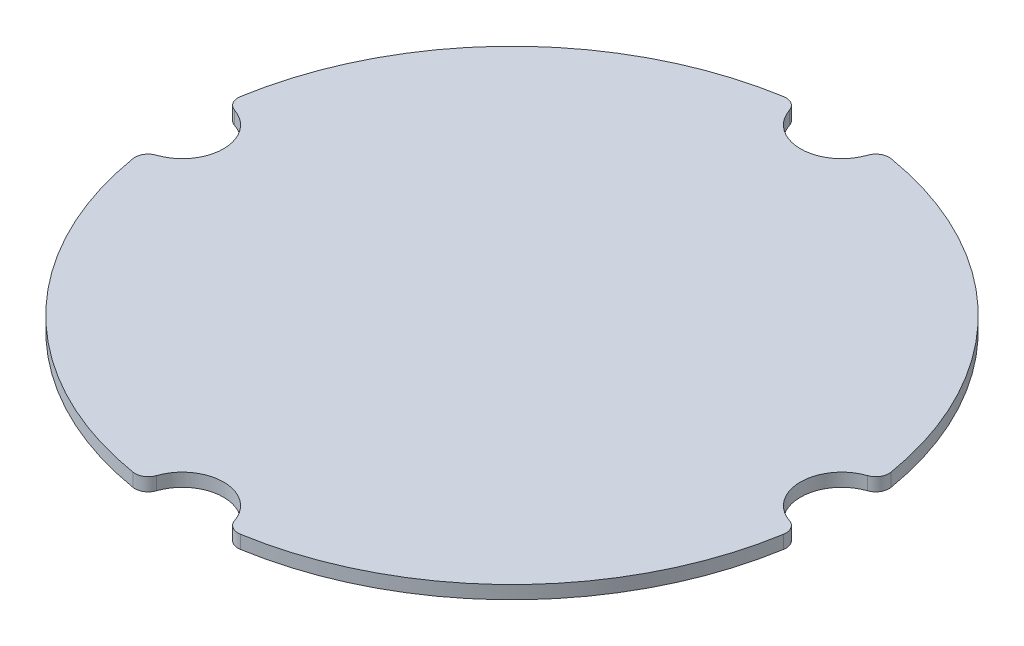
ISO-10303-21;
HEADER;
FILE_DESCRIPTION(('STEP AP214'),'2;1');
FILE_NAME('part.step','',(''),(''),'','','');
FILE_SCHEMA(('AUTOMOTIVE_DESIGN { 1 0 10303 214 1 1 1 1 }'));
ENDSEC;
DATA;
#1=APPLICATION_CONTEXT('core data for automotive mechanical design processes');
#2=APPLICATION_PROTOCOL_DEFINITION('international standard','automotive_design',2000,#1);
#3=PRODUCT_CONTEXT('',#1,'mechanical');
#4=PRODUCT('Part','Part','',(#3));
#5=PRODUCT_RELATED_PRODUCT_CATEGORY('part','',(#4));
#6=PRODUCT_DEFINITION_FORMATION('','',#4);
#7=PRODUCT_DEFINITION_CONTEXT('part definition',#1,'design');
#8=PRODUCT_DEFINITION('design','',#6,#7);
#9=PRODUCT_DEFINITION_SHAPE('','',#8);
#10=(LENGTH_UNIT() NAMED_UNIT(*) SI_UNIT(.MILLI.,.METRE.));
#11=(NAMED_UNIT(*) PLANE_ANGLE_UNIT() SI_UNIT($,.RADIAN.));
#12=(NAMED_UNIT(*) SI_UNIT($,.STERADIAN.) SOLID_ANGLE_UNIT());
#13=UNCERTAINTY_MEASURE_WITH_UNIT(LENGTH_MEASURE(1.E-05),#10,'distance_accuracy_value','');
#14=(GEOMETRIC_REPRESENTATION_CONTEXT(3) GLOBAL_UNCERTAINTY_ASSIGNED_CONTEXT((#13)) GLOBAL_UNIT_ASSIGNED_CONTEXT((#10,
#11,#12)) REPRESENTATION_CONTEXT('',''));
#15=CARTESIAN_POINT('',(0.,0.,0.));
#16=DIRECTION('',(0.,0.,1.));
#17=DIRECTION('',(1.,0.,0.));
#18=AXIS2_PLACEMENT_3D('',#15,#16,#17);
#19=CARTESIAN_POINT('',(0.,2.54,0.));
#20=DIRECTION('',(0.,-1.,0.));
#21=DIRECTION('',(0.,0.,-1.));
#22=AXIS2_PLACEMENT_3D('',#19,#20,#21);
#23=CYLINDRICAL_SURFACE('',#22,63.5);
#24=CARTESIAN_POINT('',(0.,2.54,0.));
#25=DIRECTION('',(0.,1.,0.));
#26=DIRECTION('',(0.,0.,1.));
#27=AXIS2_PLACEMENT_3D('',#24,#25,#26);
#28=CIRCLE('',#27,63.5);
#29=CARTESIAN_POINT('',(10.339894968625,2.54,62.6525065104167));
#30=VERTEX_POINT('',#29);
#31=CARTESIAN_POINT('',(62.6525065104166,2.54,10.3398949686253));
#32=VERTEX_POINT('',#31);
#33=EDGE_CURVE('E317',#30,#32,#28,.T.);
#34=ORIENTED_EDGE('',*,*,#33,.F.);
#35=DIRECTION('',(0.,-1.,0.));
#36=VECTOR('',#35,1.);
#37=CARTESIAN_POINT('',(10.339894968625,2.54,62.6525065104167));
#38=LINE('',#37,#36);
#39=CARTESIAN_POINT('',(10.339894968625,0.,62.6525065104167));
#40=VERTEX_POINT('',#39);
#41=EDGE_CURVE('E262',#30,#40,#38,.T.);
#42=ORIENTED_EDGE('',*,*,#41,.T.);
#43=CARTESIAN_POINT('',(0.,0.,0.));
#44=DIRECTION('',(0.,1.,0.));
#45=DIRECTION('',(0.,0.,1.));
#46=AXIS2_PLACEMENT_3D('',#43,#44,#45);
#47=CIRCLE('',#46,63.5);
#48=CARTESIAN_POINT('',(62.6525065104166,0.,10.3398949686253));
#49=VERTEX_POINT('',#48);
#50=EDGE_CURVE('E193',#40,#49,#47,.T.);
#51=ORIENTED_EDGE('',*,*,#50,.T.);
#52=DIRECTION('',(0.,-1.,0.));
#53=VECTOR('',#52,1.);
#54=CARTESIAN_POINT('',(62.6525065104166,2.54,10.3398949686253));
#55=LINE('',#54,#53);
#56=EDGE_CURVE('E327',#49,#32,#55,.F.);
#57=ORIENTED_EDGE('',*,*,#56,.T.);
#58=EDGE_LOOP('',(#34,#42,#51,#57));
#59=FACE_BOUND('',#58,.T.);
#60=ADVANCED_FACE('F42',(#59),#23,.T.);
#61=CARTESIAN_POINT('',(-62.6525065104168,2.54,10.3398949686244));
#62=VERTEX_POINT('',#61);
#63=CARTESIAN_POINT('',(-10.339894968625,2.54,62.6525065104167));
#64=VERTEX_POINT('',#63);
#65=EDGE_CURVE('E204',#62,#64,#28,.T.);
#66=ORIENTED_EDGE('',*,*,#65,.F.);
#67=DIRECTION('',(0.,-1.,0.));
#68=VECTOR('',#67,1.);
#69=CARTESIAN_POINT('',(-62.6525065104168,2.54,10.3398949686244));
#70=LINE('',#69,#68);
#71=CARTESIAN_POINT('',(-62.6525065104168,0.,10.3398949686244));
#72=VERTEX_POINT('',#71);
#73=EDGE_CURVE('E12',#62,#72,#70,.T.);
#74=ORIENTED_EDGE('',*,*,#73,.T.);
#75=CARTESIAN_POINT('',(-10.339894968625,0.,62.6525065104167));
#76=VERTEX_POINT('',#75);
#77=EDGE_CURVE('E314',#72,#76,#47,.T.);
#78=ORIENTED_EDGE('',*,*,#77,.T.);
#79=DIRECTION('',(0.,-1.,0.));
#80=VECTOR('',#79,1.);
#81=CARTESIAN_POINT('',(-10.339894968625,2.54,62.6525065104167));
#82=LINE('',#81,#80);
#83=EDGE_CURVE('E251',#76,#64,#82,.F.);
#84=ORIENTED_EDGE('',*,*,#83,.T.);
#85=EDGE_LOOP('',(#66,#74,#78,#84));
#86=FACE_BOUND('',#85,.T.);
#87=ADVANCED_FACE('F387',(#86),#23,.T.);
#88=CARTESIAN_POINT('',(-10.339894968625,0.,-62.6525065104167));
#89=VERTEX_POINT('',#88);
#90=CARTESIAN_POINT('',(-62.6525065104166,0.,-10.3398949686257));
#91=VERTEX_POINT('',#90);
#92=EDGE_CURVE('E195',#89,#91,#47,.T.);
#93=ORIENTED_EDGE('',*,*,#92,.T.);
#94=DIRECTION('',(0.,-1.,0.));
#95=VECTOR('',#94,1.);
#96=CARTESIAN_POINT('',(-62.6525065104166,2.54,-10.3398949686257));
#97=LINE('',#96,#95);
#98=CARTESIAN_POINT('',(-62.6525065104166,2.54,-10.3398949686257));
#99=VERTEX_POINT('',#98);
#100=EDGE_CURVE('E66',#91,#99,#97,.F.);
#101=ORIENTED_EDGE('',*,*,#100,.T.);
#102=CARTESIAN_POINT('',(-10.339894968625,2.54,-62.6525065104167));
#103=VERTEX_POINT('',#102);
#104=EDGE_CURVE('E201',#103,#99,#28,.T.);
#105=ORIENTED_EDGE('',*,*,#104,.F.);
#106=DIRECTION('',(0.,-1.,0.));
#107=VECTOR('',#106,1.);
#108=CARTESIAN_POINT('',(-10.339894968625,2.54,-62.6525065104167));
#109=LINE('',#108,#107);
#110=EDGE_CURVE('E169',#103,#89,#109,.T.);
#111=ORIENTED_EDGE('',*,*,#110,.T.);
#112=EDGE_LOOP('',(#93,#101,#105,#111));
#113=FACE_BOUND('',#112,.T.);
#114=ADVANCED_FACE('F311',(#113),#23,.T.);
#115=CARTESIAN_POINT('',(62.6525065104167,2.54,-10.3398949686248));
#116=VERTEX_POINT('',#115);
#117=CARTESIAN_POINT('',(10.339894968625,2.54,-62.6525065104167));
#118=VERTEX_POINT('',#117);
#119=EDGE_CURVE('E205',#116,#118,#28,.T.);
#120=ORIENTED_EDGE('',*,*,#119,.F.);
#121=DIRECTION('',(0.,-1.,0.));
#122=VECTOR('',#121,1.);
#123=CARTESIAN_POINT('',(62.6525065104167,2.54,-10.3398949686248));
#124=LINE('',#123,#122);
#125=CARTESIAN_POINT('',(62.6525065104167,0.,-10.3398949686248));
#126=VERTEX_POINT('',#125);
#127=EDGE_CURVE('E230',#116,#126,#124,.T.);
#128=ORIENTED_EDGE('',*,*,#127,.T.);
#129=CARTESIAN_POINT('',(10.339894968625,0.,-62.6525065104167));
#130=VERTEX_POINT('',#129);
#131=EDGE_CURVE('E189',#126,#130,#47,.T.);
#132=ORIENTED_EDGE('',*,*,#131,.T.);
#133=DIRECTION('',(0.,-1.,0.));
#134=VECTOR('',#133,1.);
#135=CARTESIAN_POINT('',(10.339894968625,2.54,-62.6525065104167));
#136=LINE('',#135,#134);
#137=EDGE_CURVE('E164',#130,#118,#136,.F.);
#138=ORIENTED_EDGE('',*,*,#137,.T.);
#139=EDGE_LOOP('',(#120,#128,#132,#138));
#140=FACE_BOUND('',#139,.T.);
#141=ADVANCED_FACE('F372',(#140),#23,.T.);
#142=CARTESIAN_POINT('',(0.,2.54,0.));
#143=DIRECTION('',(0.,1.,0.));
#144=DIRECTION('',(0.,0.,1.));
#145=AXIS2_PLACEMENT_3D('',#142,#143,#144);
#146=PLANE('',#145);
#147=ORIENTED_EDGE('',*,*,#104,.T.);
#148=CARTESIAN_POINT('',(-60.1464062499999,2.54,-9.92629916988066));
#149=DIRECTION('',(0.,1.,0.));
#150=DIRECTION('',(0.,0.,1.));
#151=AXIS2_PLACEMENT_3D('',#148,#149,#150);
#152=CIRCLE('',#151,2.54);
#153=CARTESIAN_POINT('',(-60.9593986742423,2.54,-7.51992361354612));
#154=VERTEX_POINT('',#153);
#155=EDGE_CURVE('E51',#99,#154,#152,.T.);
#156=ORIENTED_EDGE('',*,*,#155,.T.);
#157=CARTESIAN_POINT('',(-63.5,2.54,-6.65127195049617E-13));
#158=DIRECTION('',(0.,1.,0.));
#159=DIRECTION('',(1.,0.,0.));
#160=AXIS2_PLACEMENT_3D('',#157,#158,#159);
#161=CIRCLE('',#160,7.93750000000001);
#162=CARTESIAN_POINT('',(-60.9593986742425,2.54,7.51992361354484));
#163=VERTEX_POINT('',#162);
#164=EDGE_CURVE('E277',#163,#154,#161,.T.);
#165=ORIENTED_EDGE('',*,*,#164,.F.);
#166=CARTESIAN_POINT('',(-60.1464062500001,2.54,9.9262991698794));
#167=DIRECTION('',(0.,1.,0.));
#168=DIRECTION('',(0.,0.,1.));
#169=AXIS2_PLACEMENT_3D('',#166,#167,#168);
#170=CIRCLE('',#169,2.54);
#171=EDGE_CURVE('E58',#163,#62,#170,.T.);
#172=ORIENTED_EDGE('',*,*,#171,.T.);
#173=ORIENTED_EDGE('',*,*,#65,.T.);
#174=CARTESIAN_POINT('',(-9.92629916988003,2.54,60.14640625));
#175=DIRECTION('',(0.,1.,0.));
#176=DIRECTION('',(0.,0.,1.));
#177=AXIS2_PLACEMENT_3D('',#174,#175,#176);
#178=CIRCLE('',#177,2.54);
#179=CARTESIAN_POINT('',(-7.51992361354548,2.54,60.9593986742424));
#180=VERTEX_POINT('',#179);
#181=EDGE_CURVE('E258',#64,#180,#178,.T.);
#182=ORIENTED_EDGE('',*,*,#181,.T.);
#183=CARTESIAN_POINT('',(0.,2.54,63.5));
#184=DIRECTION('',(0.,1.,0.));
#185=DIRECTION('',(0.,0.,-1.));
#186=AXIS2_PLACEMENT_3D('',#183,#184,#185);
#187=CIRCLE('',#186,7.93750000000001);
#188=CARTESIAN_POINT('',(7.51992361354548,2.54,60.9593986742424));
#189=VERTEX_POINT('',#188);
#190=EDGE_CURVE('E265',#189,#180,#187,.T.);
#191=ORIENTED_EDGE('',*,*,#190,.F.);
#192=CARTESIAN_POINT('',(9.92629916988003,2.54,60.14640625));
#193=DIRECTION('',(0.,1.,0.));
#194=DIRECTION('',(0.,0.,1.));
#195=AXIS2_PLACEMENT_3D('',#192,#193,#194);
#196=CIRCLE('',#195,2.54);
#197=EDGE_CURVE('E254',#189,#30,#196,.T.);
#198=ORIENTED_EDGE('',*,*,#197,.T.);
#199=ORIENTED_EDGE('',*,*,#33,.T.);
#200=CARTESIAN_POINT('',(60.14640625,2.54,9.92629916988024));
#201=DIRECTION('',(0.,1.,0.));
#202=DIRECTION('',(0.,0.,1.));
#203=AXIS2_PLACEMENT_3D('',#200,#201,#202);
#204=CIRCLE('',#203,2.54);
#205=CARTESIAN_POINT('',(60.9593986742424,2.54,7.51992361354569));
#206=VERTEX_POINT('',#205);
#207=EDGE_CURVE('E225',#32,#206,#204,.T.);
#208=ORIENTED_EDGE('',*,*,#207,.T.);
#209=CARTESIAN_POINT('',(63.5,2.54,2.21709065016539E-13));
#210=DIRECTION('',(0.,1.,0.));
#211=DIRECTION('',(-1.,0.,0.));
#212=AXIS2_PLACEMENT_3D('',#209,#210,#211);
#213=CIRCLE('',#212,7.93750000000001);
#214=CARTESIAN_POINT('',(60.9593986742424,2.54,-7.51992361354527));
#215=VERTEX_POINT('',#214);
#216=EDGE_CURVE('E276',#215,#206,#213,.T.);
#217=ORIENTED_EDGE('',*,*,#216,.F.);
#218=CARTESIAN_POINT('',(60.14640625,2.54,-9.92629916987982));
#219=DIRECTION('',(0.,1.,0.));
#220=DIRECTION('',(0.,0.,1.));
#221=AXIS2_PLACEMENT_3D('',#218,#219,#220);
#222=CIRCLE('',#221,2.54);
#223=EDGE_CURVE('E231',#215,#116,#222,.T.);
#224=ORIENTED_EDGE('',*,*,#223,.T.);
#225=ORIENTED_EDGE('',*,*,#119,.T.);
#226=CARTESIAN_POINT('',(9.92629916988003,2.54,-60.14640625));
#227=DIRECTION('',(0.,1.,0.));
#228=DIRECTION('',(0.,0.,1.));
#229=AXIS2_PLACEMENT_3D('',#226,#227,#228);
#230=CIRCLE('',#229,2.54);
#231=CARTESIAN_POINT('',(7.51992361354548,2.54,-60.9593986742424));
#232=VERTEX_POINT('',#231);
#233=EDGE_CURVE('E353',#118,#232,#230,.T.);
#234=ORIENTED_EDGE('',*,*,#233,.T.);
#235=CARTESIAN_POINT('',(0.,2.54,-63.5));
#236=DIRECTION('',(0.,1.,0.));
#237=DIRECTION('',(0.,0.,1.));
#238=AXIS2_PLACEMENT_3D('',#235,#236,#237);
#239=CIRCLE('',#238,7.93750000000001);
#240=CARTESIAN_POINT('',(-7.51992361354548,2.54,-60.9593986742424));
#241=VERTEX_POINT('',#240);
#242=EDGE_CURVE('E180',#241,#232,#239,.T.);
#243=ORIENTED_EDGE('',*,*,#242,.F.);
#244=CARTESIAN_POINT('',(-9.92629916988003,2.54,-60.14640625));
#245=DIRECTION('',(0.,1.,0.));
#246=DIRECTION('',(0.,0.,1.));
#247=AXIS2_PLACEMENT_3D('',#244,#245,#246);
#248=CIRCLE('',#247,2.54);
#249=EDGE_CURVE('E356',#241,#103,#248,.T.);
#250=ORIENTED_EDGE('',*,*,#249,.T.);
#251=EDGE_LOOP('',(#147,#156,#165,#172,#173,#182,#191,#198,#199,#208,#217,#224,#225,#234,#243,#250));
#252=FACE_BOUND('',#251,.T.);
#253=ADVANCED_FACE('F290',(#252),#146,.T.);
#254=CARTESIAN_POINT('',(0.,0.,0.));
#255=DIRECTION('',(0.,1.,0.));
#256=DIRECTION('',(0.,0.,1.));
#257=AXIS2_PLACEMENT_3D('',#254,#255,#256);
#258=PLANE('',#257);
#259=CARTESIAN_POINT('',(-63.5,0.,-6.65127195049617E-13));
#260=DIRECTION('',(0.,1.,0.));
#261=DIRECTION('',(0.,0.,1.));
#262=AXIS2_PLACEMENT_3D('',#259,#260,#261);
#263=CIRCLE('',#262,7.93750000000001);
#264=CARTESIAN_POINT('',(-60.9593986742423,0.,-7.51992361354612));
#265=VERTEX_POINT('',#264);
#266=CARTESIAN_POINT('',(-60.9593986742425,0.,7.51992361354484));
#267=VERTEX_POINT('',#266);
#268=EDGE_CURVE('E272',#265,#267,#263,.F.);
#269=ORIENTED_EDGE('',*,*,#268,.F.);
#270=CARTESIAN_POINT('',(-60.1464062499999,0.,-9.92629916988066));
#271=DIRECTION('',(0.,1.,0.));
#272=DIRECTION('',(0.,0.,1.));
#273=AXIS2_PLACEMENT_3D('',#270,#271,#272);
#274=CIRCLE('',#273,2.54);
#275=EDGE_CURVE('E302',#265,#91,#274,.F.);
#276=ORIENTED_EDGE('',*,*,#275,.T.);
#277=ORIENTED_EDGE('',*,*,#92,.F.);
#278=CARTESIAN_POINT('',(-9.92629916988003,0.,-60.14640625));
#279=DIRECTION('',(0.,1.,0.));
#280=DIRECTION('',(0.,0.,1.));
#281=AXIS2_PLACEMENT_3D('',#278,#279,#280);
#282=CIRCLE('',#281,2.54);
#283=CARTESIAN_POINT('',(-7.51992361354548,0.,-60.9593986742424));
#284=VERTEX_POINT('',#283);
#285=EDGE_CURVE('E170',#89,#284,#282,.F.);
#286=ORIENTED_EDGE('',*,*,#285,.T.);
#287=CARTESIAN_POINT('',(0.,0.,-63.5));
#288=DIRECTION('',(0.,1.,0.));
#289=DIRECTION('',(0.,0.,1.));
#290=AXIS2_PLACEMENT_3D('',#287,#288,#289);
#291=CIRCLE('',#290,7.93750000000001);
#292=CARTESIAN_POINT('',(7.51992361354548,0.,-60.9593986742424));
#293=VERTEX_POINT('',#292);
#294=EDGE_CURVE('E177',#293,#284,#291,.F.);
#295=ORIENTED_EDGE('',*,*,#294,.F.);
#296=CARTESIAN_POINT('',(9.92629916988003,0.,-60.14640625));
#297=DIRECTION('',(0.,1.,0.));
#298=DIRECTION('',(0.,0.,1.));
#299=AXIS2_PLACEMENT_3D('',#296,#297,#298);
#300=CIRCLE('',#299,2.54);
#301=EDGE_CURVE('E158',#293,#130,#300,.F.);
#302=ORIENTED_EDGE('',*,*,#301,.T.);
#303=ORIENTED_EDGE('',*,*,#131,.F.);
#304=CARTESIAN_POINT('',(60.14640625,0.,-9.92629916987982));
#305=DIRECTION('',(0.,1.,0.));
#306=DIRECTION('',(0.,0.,1.));
#307=AXIS2_PLACEMENT_3D('',#304,#305,#306);
#308=CIRCLE('',#307,2.54);
#309=CARTESIAN_POINT('',(60.9593986742424,0.,-7.51992361354527));
#310=VERTEX_POINT('',#309);
#311=EDGE_CURVE('E338',#126,#310,#308,.F.);
#312=ORIENTED_EDGE('',*,*,#311,.T.);
#313=CARTESIAN_POINT('',(63.5,0.,2.21709065016539E-13));
#314=DIRECTION('',(0.,1.,0.));
#315=DIRECTION('',(0.,0.,1.));
#316=AXIS2_PLACEMENT_3D('',#313,#314,#315);
#317=CIRCLE('',#316,7.93750000000001);
#318=CARTESIAN_POINT('',(60.9593986742424,0.,7.51992361354569));
#319=VERTEX_POINT('',#318);
#320=EDGE_CURVE('E196',#319,#310,#317,.F.);
#321=ORIENTED_EDGE('',*,*,#320,.F.);
#322=CARTESIAN_POINT('',(60.14640625,0.,9.92629916988024));
#323=DIRECTION('',(0.,1.,0.));
#324=DIRECTION('',(0.,0.,1.));
#325=AXIS2_PLACEMENT_3D('',#322,#323,#324);
#326=CIRCLE('',#325,2.54);
#327=EDGE_CURVE('E332',#319,#49,#326,.F.);
#328=ORIENTED_EDGE('',*,*,#327,.T.);
#329=ORIENTED_EDGE('',*,*,#50,.F.);
#330=CARTESIAN_POINT('',(9.92629916988003,0.,60.14640625));
#331=DIRECTION('',(0.,1.,0.));
#332=DIRECTION('',(0.,0.,1.));
#333=AXIS2_PLACEMENT_3D('',#330,#331,#332);
#334=CIRCLE('',#333,2.54);
#335=CARTESIAN_POINT('',(7.51992361354548,0.,60.9593986742424));
#336=VERTEX_POINT('',#335);
#337=EDGE_CURVE('E244',#40,#336,#334,.F.);
#338=ORIENTED_EDGE('',*,*,#337,.T.);
#339=CARTESIAN_POINT('',(0.,0.,63.5));
#340=DIRECTION('',(0.,1.,0.));
#341=DIRECTION('',(0.,0.,1.));
#342=AXIS2_PLACEMENT_3D('',#339,#340,#341);
#343=CIRCLE('',#342,7.93750000000001);
#344=CARTESIAN_POINT('',(-7.51992361354548,0.,60.9593986742424));
#345=VERTEX_POINT('',#344);
#346=EDGE_CURVE('E271',#345,#336,#343,.F.);
#347=ORIENTED_EDGE('',*,*,#346,.F.);
#348=CARTESIAN_POINT('',(-9.92629916988003,0.,60.14640625));
#349=DIRECTION('',(0.,1.,0.));
#350=DIRECTION('',(0.,0.,1.));
#351=AXIS2_PLACEMENT_3D('',#348,#349,#350);
#352=CIRCLE('',#351,2.54);
#353=EDGE_CURVE('E247',#345,#76,#352,.F.);
#354=ORIENTED_EDGE('',*,*,#353,.T.);
#355=ORIENTED_EDGE('',*,*,#77,.F.);
#356=CARTESIAN_POINT('',(-60.1464062500001,0.,9.9262991698794));
#357=DIRECTION('',(0.,1.,0.));
#358=DIRECTION('',(0.,0.,1.));
#359=AXIS2_PLACEMENT_3D('',#356,#357,#358);
#360=CIRCLE('',#359,2.54);
#361=EDGE_CURVE('E304',#72,#267,#360,.F.);
#362=ORIENTED_EDGE('',*,*,#361,.T.);
#363=EDGE_LOOP('',(#269,#276,#277,#286,#295,#302,#303,#312,#321,#328,#329,#338,#347,#354,#355,#362));
#364=FACE_BOUND('',#363,.T.);
#365=ADVANCED_FACE('F185',(#364),#258,.F.);
#366=CARTESIAN_POINT('',(0.,-0.00100000000000013,-63.5));
#367=DIRECTION('',(0.,1.,0.));
#368=DIRECTION('',(0.,0.,1.));
#369=AXIS2_PLACEMENT_3D('',#366,#367,#368);
#370=CYLINDRICAL_SURFACE('',#369,7.93750000000001);
#371=ORIENTED_EDGE('',*,*,#242,.T.);
#372=DIRECTION('',(0.,1.,0.));
#373=VECTOR('',#372,1.);
#374=CARTESIAN_POINT('',(7.51992361354548,-0.00100000000000013,-60.9593986742424));
#375=LINE('',#374,#373);
#376=EDGE_CURVE('E162',#232,#293,#375,.F.);
#377=ORIENTED_EDGE('',*,*,#376,.T.);
#378=ORIENTED_EDGE('',*,*,#294,.T.);
#379=DIRECTION('',(0.,1.,0.));
#380=VECTOR('',#379,1.);
#381=CARTESIAN_POINT('',(-7.51992361354548,-0.00100000000000013,-60.9593986742424));
#382=LINE('',#381,#380);
#383=EDGE_CURVE('E182',#284,#241,#382,.T.);
#384=ORIENTED_EDGE('',*,*,#383,.T.);
#385=EDGE_LOOP('',(#371,#377,#378,#384));
#386=FACE_BOUND('',#385,.T.);
#387=ADVANCED_FACE('F175',(#386),#370,.F.);
#388=CARTESIAN_POINT('',(9.92629916988003,2.54,-60.14640625));
#389=DIRECTION('',(0.,1.,0.));
#390=DIRECTION('',(0.,0.,1.));
#391=AXIS2_PLACEMENT_3D('',#388,#389,#390);
#392=CYLINDRICAL_SURFACE('',#391,2.54);
#393=ORIENTED_EDGE('',*,*,#233,.F.);
#394=ORIENTED_EDGE('',*,*,#137,.F.);
#395=ORIENTED_EDGE('',*,*,#301,.F.);
#396=ORIENTED_EDGE('',*,*,#376,.F.);
#397=EDGE_LOOP('',(#393,#394,#395,#396));
#398=FACE_BOUND('',#397,.T.);
#399=ADVANCED_FACE('F161',(#398),#392,.T.);
#400=CARTESIAN_POINT('',(-9.92629916988003,2.54,-60.14640625));
#401=DIRECTION('',(0.,-1.,0.));
#402=DIRECTION('',(0.,0.,-1.));
#403=AXIS2_PLACEMENT_3D('',#400,#401,#402);
#404=CYLINDRICAL_SURFACE('',#403,2.54);
#405=ORIENTED_EDGE('',*,*,#285,.F.);
#406=ORIENTED_EDGE('',*,*,#110,.F.);
#407=ORIENTED_EDGE('',*,*,#249,.F.);
#408=ORIENTED_EDGE('',*,*,#383,.F.);
#409=EDGE_LOOP('',(#405,#406,#407,#408));
#410=FACE_BOUND('',#409,.T.);
#411=ADVANCED_FACE('F439',(#410),#404,.T.);
#412=CARTESIAN_POINT('',(-63.5,-0.00100000000000013,-6.65127195049617E-13));
#413=DIRECTION('',(0.,1.,0.));
#414=DIRECTION('',(0.,0.,1.));
#415=AXIS2_PLACEMENT_3D('',#412,#413,#414);
#416=CYLINDRICAL_SURFACE('',#415,7.93750000000001);
#417=ORIENTED_EDGE('',*,*,#164,.T.);
#418=DIRECTION('',(0.,1.,0.));
#419=VECTOR('',#418,1.);
#420=CARTESIAN_POINT('',(-60.9593986742423,-0.00100000000000013,-7.51992361354612));
#421=LINE('',#420,#419);
#422=EDGE_CURVE('E298',#154,#265,#421,.F.);
#423=ORIENTED_EDGE('',*,*,#422,.T.);
#424=ORIENTED_EDGE('',*,*,#268,.T.);
#425=DIRECTION('',(0.,1.,0.));
#426=VECTOR('',#425,1.);
#427=CARTESIAN_POINT('',(-60.9593986742425,-0.00100000000000013,7.51992361354484));
#428=LINE('',#427,#426);
#429=EDGE_CURVE('E300',#267,#163,#428,.T.);
#430=ORIENTED_EDGE('',*,*,#429,.T.);
#431=EDGE_LOOP('',(#417,#423,#424,#430));
#432=FACE_BOUND('',#431,.T.);
#433=ADVANCED_FACE('F296',(#432),#416,.F.);
#434=CARTESIAN_POINT('',(0.,-0.00100000000000013,63.5));
#435=DIRECTION('',(0.,1.,0.));
#436=DIRECTION('',(0.,0.,1.));
#437=AXIS2_PLACEMENT_3D('',#434,#435,#436);
#438=CYLINDRICAL_SURFACE('',#437,7.93750000000001);
#439=ORIENTED_EDGE('',*,*,#190,.T.);
#440=DIRECTION('',(0.,1.,0.));
#441=VECTOR('',#440,1.);
#442=CARTESIAN_POINT('',(-7.51992361354548,-0.00100000000000013,60.9593986742424));
#443=LINE('',#442,#441);
#444=EDGE_CURVE('E240',#180,#345,#443,.F.);
#445=ORIENTED_EDGE('',*,*,#444,.T.);
#446=ORIENTED_EDGE('',*,*,#346,.T.);
#447=DIRECTION('',(0.,1.,0.));
#448=VECTOR('',#447,1.);
#449=CARTESIAN_POINT('',(7.51992361354548,-0.00100000000000013,60.9593986742424));
#450=LINE('',#449,#448);
#451=EDGE_CURVE('E236',#336,#189,#450,.T.);
#452=ORIENTED_EDGE('',*,*,#451,.T.);
#453=EDGE_LOOP('',(#439,#445,#446,#452));
#454=FACE_BOUND('',#453,.T.);
#455=ADVANCED_FACE('F396',(#454),#438,.F.);
#456=CARTESIAN_POINT('',(63.5,-0.00100000000000013,2.21709065016539E-13));
#457=DIRECTION('',(0.,1.,0.));
#458=DIRECTION('',(0.,0.,1.));
#459=AXIS2_PLACEMENT_3D('',#456,#457,#458);
#460=CYLINDRICAL_SURFACE('',#459,7.93750000000001);
#461=ORIENTED_EDGE('',*,*,#216,.T.);
#462=DIRECTION('',(0.,1.,0.));
#463=VECTOR('',#462,1.);
#464=CARTESIAN_POINT('',(60.9593986742424,-0.00100000000000013,7.51992361354569));
#465=LINE('',#464,#463);
#466=EDGE_CURVE('E346',#206,#319,#465,.F.);
#467=ORIENTED_EDGE('',*,*,#466,.T.);
#468=ORIENTED_EDGE('',*,*,#320,.T.);
#469=DIRECTION('',(0.,1.,0.));
#470=VECTOR('',#469,1.);
#471=CARTESIAN_POINT('',(60.9593986742424,-0.00100000000000013,-7.51992361354527));
#472=LINE('',#471,#470);
#473=EDGE_CURVE('E349',#310,#215,#472,.T.);
#474=ORIENTED_EDGE('',*,*,#473,.T.);
#475=EDGE_LOOP('',(#461,#467,#468,#474));
#476=FACE_BOUND('',#475,.T.);
#477=ADVANCED_FACE('F379',(#476),#460,.F.);
#478=CARTESIAN_POINT('',(60.14640625,2.54,9.92629916988024));
#479=DIRECTION('',(0.,1.,0.));
#480=DIRECTION('',(0.,0.,1.));
#481=AXIS2_PLACEMENT_3D('',#478,#479,#480);
#482=CYLINDRICAL_SURFACE('',#481,2.54);
#483=ORIENTED_EDGE('',*,*,#207,.F.);
#484=ORIENTED_EDGE('',*,*,#56,.F.);
#485=ORIENTED_EDGE('',*,*,#327,.F.);
#486=ORIENTED_EDGE('',*,*,#466,.F.);
#487=EDGE_LOOP('',(#483,#484,#485,#486));
#488=FACE_BOUND('',#487,.T.);
#489=ADVANCED_FACE('F340',(#488),#482,.T.);
#490=CARTESIAN_POINT('',(60.14640625,2.54,-9.92629916987982));
#491=DIRECTION('',(0.,-1.,0.));
#492=DIRECTION('',(0.,0.,-1.));
#493=AXIS2_PLACEMENT_3D('',#490,#491,#492);
#494=CYLINDRICAL_SURFACE('',#493,2.54);
#495=ORIENTED_EDGE('',*,*,#311,.F.);
#496=ORIENTED_EDGE('',*,*,#127,.F.);
#497=ORIENTED_EDGE('',*,*,#223,.F.);
#498=ORIENTED_EDGE('',*,*,#473,.F.);
#499=EDGE_LOOP('',(#495,#496,#497,#498));
#500=FACE_BOUND('',#499,.T.);
#501=ADVANCED_FACE('F376',(#500),#494,.T.);
#502=CARTESIAN_POINT('',(-9.92629916988003,2.54,60.14640625));
#503=DIRECTION('',(0.,1.,0.));
#504=DIRECTION('',(0.,0.,1.));
#505=AXIS2_PLACEMENT_3D('',#502,#503,#504);
#506=CYLINDRICAL_SURFACE('',#505,2.54);
#507=ORIENTED_EDGE('',*,*,#181,.F.);
#508=ORIENTED_EDGE('',*,*,#83,.F.);
#509=ORIENTED_EDGE('',*,*,#353,.F.);
#510=ORIENTED_EDGE('',*,*,#444,.F.);
#511=EDGE_LOOP('',(#507,#508,#509,#510));
#512=FACE_BOUND('',#511,.T.);
#513=ADVANCED_FACE('F393',(#512),#506,.T.);
#514=CARTESIAN_POINT('',(9.92629916988003,2.54,60.14640625));
#515=DIRECTION('',(0.,-1.,0.));
#516=DIRECTION('',(0.,0.,-1.));
#517=AXIS2_PLACEMENT_3D('',#514,#515,#516);
#518=CYLINDRICAL_SURFACE('',#517,2.54);
#519=ORIENTED_EDGE('',*,*,#337,.F.);
#520=ORIENTED_EDGE('',*,*,#41,.F.);
#521=ORIENTED_EDGE('',*,*,#197,.F.);
#522=ORIENTED_EDGE('',*,*,#451,.F.);
#523=EDGE_LOOP('',(#519,#520,#521,#522));
#524=FACE_BOUND('',#523,.T.);
#525=ADVANCED_FACE('F399',(#524),#518,.T.);
#526=CARTESIAN_POINT('',(-60.1464062499999,2.54,-9.92629916988066));
#527=DIRECTION('',(0.,1.,0.));
#528=DIRECTION('',(0.,0.,1.));
#529=AXIS2_PLACEMENT_3D('',#526,#527,#528);
#530=CYLINDRICAL_SURFACE('',#529,2.54);
#531=ORIENTED_EDGE('',*,*,#155,.F.);
#532=ORIENTED_EDGE('',*,*,#100,.F.);
#533=ORIENTED_EDGE('',*,*,#275,.F.);
#534=ORIENTED_EDGE('',*,*,#422,.F.);
#535=EDGE_LOOP('',(#531,#532,#533,#534));
#536=FACE_BOUND('',#535,.T.);
#537=ADVANCED_FACE('F301',(#536),#530,.T.);
#538=CARTESIAN_POINT('',(-60.1464062500001,2.54,9.9262991698794));
#539=DIRECTION('',(0.,-1.,0.));
#540=DIRECTION('',(0.,0.,-1.));
#541=AXIS2_PLACEMENT_3D('',#538,#539,#540);
#542=CYLINDRICAL_SURFACE('',#541,2.54);
#543=ORIENTED_EDGE('',*,*,#361,.F.);
#544=ORIENTED_EDGE('',*,*,#73,.F.);
#545=ORIENTED_EDGE('',*,*,#171,.F.);
#546=ORIENTED_EDGE('',*,*,#429,.F.);
#547=EDGE_LOOP('',(#543,#544,#545,#546));
#548=FACE_BOUND('',#547,.T.);
#549=ADVANCED_FACE('F44',(#548),#542,.T.);
#550=CLOSED_SHELL('',(#60,#87,#114,#141,#253,#365,#387,#399,#411,#433,#455,#477,#489,#501,#513,
#525,#537,#549));
#551=MANIFOLD_SOLID_BREP('B2',#550);
#552=ADVANCED_BREP_SHAPE_REPRESENTATION('',(#18,#551),#14);
#553=SHAPE_DEFINITION_REPRESENTATION(#9,#552);
ENDSEC;
END-ISO-10303-21;
